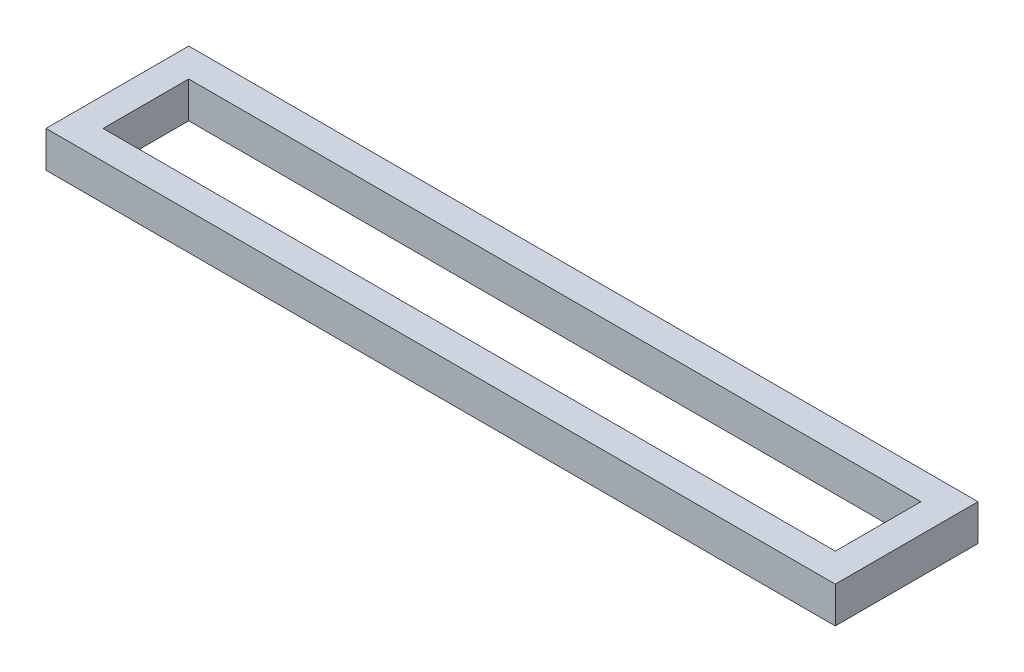
ISO-10303-21;
HEADER;
FILE_DESCRIPTION(('STEP AP214'),'2;1');
FILE_NAME('part.step','',(''),(''),'','','');
FILE_SCHEMA(('AUTOMOTIVE_DESIGN { 1 0 10303 214 1 1 1 1 }'));
ENDSEC;
DATA;
#1=APPLICATION_CONTEXT('core data for automotive mechanical design processes');
#2=APPLICATION_PROTOCOL_DEFINITION('international standard','automotive_design',2000,#1);
#3=PRODUCT_CONTEXT('',#1,'mechanical');
#4=PRODUCT('Part','Part','',(#3));
#5=PRODUCT_RELATED_PRODUCT_CATEGORY('part','',(#4));
#6=PRODUCT_DEFINITION_FORMATION('','',#4);
#7=PRODUCT_DEFINITION_CONTEXT('part definition',#1,'design');
#8=PRODUCT_DEFINITION('design','',#6,#7);
#9=PRODUCT_DEFINITION_SHAPE('','',#8);
#10=(LENGTH_UNIT() NAMED_UNIT(*) SI_UNIT(.MILLI.,.METRE.));
#11=(NAMED_UNIT(*) PLANE_ANGLE_UNIT() SI_UNIT($,.RADIAN.));
#12=(NAMED_UNIT(*) SI_UNIT($,.STERADIAN.) SOLID_ANGLE_UNIT());
#13=UNCERTAINTY_MEASURE_WITH_UNIT(LENGTH_MEASURE(1.E-05),#10,'distance_accuracy_value','');
#14=(GEOMETRIC_REPRESENTATION_CONTEXT(3) GLOBAL_UNCERTAINTY_ASSIGNED_CONTEXT((#13)) GLOBAL_UNIT_ASSIGNED_CONTEXT((#10,
#11,#12)) REPRESENTATION_CONTEXT('',''));
#15=CARTESIAN_POINT('',(0.,0.,0.));
#16=DIRECTION('',(0.,0.,1.));
#17=DIRECTION('',(1.,0.,0.));
#18=AXIS2_PLACEMENT_3D('',#15,#16,#17);
#19=CARTESIAN_POINT('',(0.,6.35,0.));
#20=DIRECTION('',(0.,-1.,0.));
#21=DIRECTION('',(0.,0.,-1.));
#22=AXIS2_PLACEMENT_3D('',#19,#20,#21);
#23=PLANE('',#22);
#24=DIRECTION('',(0.,0.,1.));
#25=VECTOR('',#24,1.);
#26=CARTESIAN_POINT('',(-5.,6.35,5.));
#27=LINE('',#26,#25);
#28=CARTESIAN_POINT('',(-5.,6.35,-20.));
#29=VERTEX_POINT('',#28);
#30=CARTESIAN_POINT('',(-5.,6.35,5.));
#31=VERTEX_POINT('',#30);
#32=EDGE_CURVE('E159',#29,#31,#27,.T.);
#33=ORIENTED_EDGE('',*,*,#32,.T.);
#34=DIRECTION('',(1.,0.,0.));
#35=VECTOR('',#34,1.);
#36=CARTESIAN_POINT('',(-5.,6.35,5.));
#37=LINE('',#36,#35);
#38=CARTESIAN_POINT('',(133.25,6.35,5.));
#39=VERTEX_POINT('',#38);
#40=EDGE_CURVE('E163',#31,#39,#37,.T.);
#41=ORIENTED_EDGE('',*,*,#40,.T.);
#42=DIRECTION('',(0.,0.,-1.));
#43=VECTOR('',#42,1.);
#44=CARTESIAN_POINT('',(133.25,6.35,5.));
#45=LINE('',#44,#43);
#46=CARTESIAN_POINT('',(133.25,6.35,-20.));
#47=VERTEX_POINT('',#46);
#48=EDGE_CURVE('E167',#39,#47,#45,.T.);
#49=ORIENTED_EDGE('',*,*,#48,.T.);
#50=DIRECTION('',(-1.,0.,0.));
#51=VECTOR('',#50,1.);
#52=CARTESIAN_POINT('',(-5.,6.35,-20.));
#53=LINE('',#52,#51);
#54=EDGE_CURVE('E170',#47,#29,#53,.T.);
#55=ORIENTED_EDGE('',*,*,#54,.T.);
#56=EDGE_LOOP('',(#33,#41,#49,#55));
#57=FACE_BOUND('',#56,.T.);
#58=DIRECTION('',(0.,0.,1.));
#59=VECTOR('',#58,1.);
#60=CARTESIAN_POINT('',(0.,6.35,0.));
#61=LINE('',#60,#59);
#62=CARTESIAN_POINT('',(0.,6.35,-15.));
#63=VERTEX_POINT('',#62);
#64=CARTESIAN_POINT('',(0.,6.35,0.));
#65=VERTEX_POINT('',#64);
#66=EDGE_CURVE('E111',#63,#65,#61,.T.);
#67=ORIENTED_EDGE('',*,*,#66,.F.);
#68=DIRECTION('',(-1.,0.,0.));
#69=VECTOR('',#68,1.);
#70=CARTESIAN_POINT('',(0.,6.35,-15.));
#71=LINE('',#70,#69);
#72=CARTESIAN_POINT('',(128.25,6.35,-15.));
#73=VERTEX_POINT('',#72);
#74=EDGE_CURVE('E137',#73,#63,#71,.T.);
#75=ORIENTED_EDGE('',*,*,#74,.F.);
#76=DIRECTION('',(0.,0.,-1.));
#77=VECTOR('',#76,1.);
#78=CARTESIAN_POINT('',(128.25,6.35,0.));
#79=LINE('',#78,#77);
#80=CARTESIAN_POINT('',(128.25,6.35,0.));
#81=VERTEX_POINT('',#80);
#82=EDGE_CURVE('E133',#81,#73,#79,.T.);
#83=ORIENTED_EDGE('',*,*,#82,.F.);
#84=DIRECTION('',(1.,0.,0.));
#85=VECTOR('',#84,1.);
#86=CARTESIAN_POINT('',(0.,6.35,0.));
#87=LINE('',#86,#85);
#88=EDGE_CURVE('E120',#65,#81,#87,.T.);
#89=ORIENTED_EDGE('',*,*,#88,.F.);
#90=EDGE_LOOP('',(#67,#75,#83,#89));
#91=FACE_BOUND('',#90,.T.);
#92=ADVANCED_FACE('F45',(#57,#91),#23,.F.);
#93=CARTESIAN_POINT('',(0.,0.,0.));
#94=DIRECTION('',(0.,-1.,0.));
#95=DIRECTION('',(0.,0.,-1.));
#96=AXIS2_PLACEMENT_3D('',#93,#94,#95);
#97=PLANE('',#96);
#98=DIRECTION('',(0.,0.,1.));
#99=VECTOR('',#98,1.);
#100=CARTESIAN_POINT('',(-5.,0.,5.));
#101=LINE('',#100,#99);
#102=CARTESIAN_POINT('',(-5.,0.,-20.));
#103=VERTEX_POINT('',#102);
#104=CARTESIAN_POINT('',(-5.,0.,5.));
#105=VERTEX_POINT('',#104);
#106=EDGE_CURVE('E129',#103,#105,#101,.T.);
#107=ORIENTED_EDGE('',*,*,#106,.F.);
#108=DIRECTION('',(-1.,0.,0.));
#109=VECTOR('',#108,1.);
#110=CARTESIAN_POINT('',(-5.,0.,-20.));
#111=LINE('',#110,#109);
#112=CARTESIAN_POINT('',(133.25,0.,-20.));
#113=VERTEX_POINT('',#112);
#114=EDGE_CURVE('E164',#113,#103,#111,.T.);
#115=ORIENTED_EDGE('',*,*,#114,.F.);
#116=DIRECTION('',(0.,0.,-1.));
#117=VECTOR('',#116,1.);
#118=CARTESIAN_POINT('',(133.25,0.,5.));
#119=LINE('',#118,#117);
#120=CARTESIAN_POINT('',(133.25,0.,5.));
#121=VERTEX_POINT('',#120);
#122=EDGE_CURVE('E180',#121,#113,#119,.T.);
#123=ORIENTED_EDGE('',*,*,#122,.F.);
#124=DIRECTION('',(1.,0.,0.));
#125=VECTOR('',#124,1.);
#126=CARTESIAN_POINT('',(-5.,0.,5.));
#127=LINE('',#126,#125);
#128=EDGE_CURVE('E177',#105,#121,#127,.T.);
#129=ORIENTED_EDGE('',*,*,#128,.F.);
#130=EDGE_LOOP('',(#107,#115,#123,#129));
#131=FACE_BOUND('',#130,.T.);
#132=DIRECTION('',(-1.,0.,0.));
#133=VECTOR('',#132,1.);
#134=CARTESIAN_POINT('',(0.,0.,-15.));
#135=LINE('',#134,#133);
#136=CARTESIAN_POINT('',(128.25,0.,-15.));
#137=VERTEX_POINT('',#136);
#138=CARTESIAN_POINT('',(0.,0.,-15.));
#139=VERTEX_POINT('',#138);
#140=EDGE_CURVE('E121',#137,#139,#135,.T.);
#141=ORIENTED_EDGE('',*,*,#140,.T.);
#142=DIRECTION('',(0.,0.,1.));
#143=VECTOR('',#142,1.);
#144=CARTESIAN_POINT('',(0.,0.,0.));
#145=LINE('',#144,#143);
#146=CARTESIAN_POINT('',(0.,0.,0.));
#147=VERTEX_POINT('',#146);
#148=EDGE_CURVE('E69',#139,#147,#145,.T.);
#149=ORIENTED_EDGE('',*,*,#148,.T.);
#150=DIRECTION('',(1.,0.,0.));
#151=VECTOR('',#150,1.);
#152=CARTESIAN_POINT('',(0.,0.,0.));
#153=LINE('',#152,#151);
#154=CARTESIAN_POINT('',(128.25,0.,0.));
#155=VERTEX_POINT('',#154);
#156=EDGE_CURVE('E127',#147,#155,#153,.T.);
#157=ORIENTED_EDGE('',*,*,#156,.T.);
#158=DIRECTION('',(0.,0.,-1.));
#159=VECTOR('',#158,1.);
#160=CARTESIAN_POINT('',(128.25,0.,0.));
#161=LINE('',#160,#159);
#162=EDGE_CURVE('E146',#155,#137,#161,.T.);
#163=ORIENTED_EDGE('',*,*,#162,.T.);
#164=EDGE_LOOP('',(#141,#149,#157,#163));
#165=FACE_BOUND('',#164,.T.);
#166=ADVANCED_FACE('F203',(#131,#165),#97,.T.);
#167=CARTESIAN_POINT('',(-5.,6.35,5.));
#168=DIRECTION('',(1.,0.,0.));
#169=DIRECTION('',(0.,0.,-1.));
#170=AXIS2_PLACEMENT_3D('',#167,#168,#169);
#171=PLANE('',#170);
#172=ORIENTED_EDGE('',*,*,#106,.T.);
#173=DIRECTION('',(0.,-1.,0.));
#174=VECTOR('',#173,1.);
#175=CARTESIAN_POINT('',(-5.,6.35,5.));
#176=LINE('',#175,#174);
#177=EDGE_CURVE('E11',#31,#105,#176,.T.);
#178=ORIENTED_EDGE('',*,*,#177,.F.);
#179=ORIENTED_EDGE('',*,*,#32,.F.);
#180=DIRECTION('',(0.,-1.,0.));
#181=VECTOR('',#180,1.);
#182=CARTESIAN_POINT('',(-5.,6.35,-20.));
#183=LINE('',#182,#181);
#184=EDGE_CURVE('E173',#29,#103,#183,.T.);
#185=ORIENTED_EDGE('',*,*,#184,.T.);
#186=EDGE_LOOP('',(#172,#178,#179,#185));
#187=FACE_BOUND('',#186,.T.);
#188=ADVANCED_FACE('F47',(#187),#171,.F.);
#189=CARTESIAN_POINT('',(-5.,6.35,5.));
#190=DIRECTION('',(0.,0.,-1.));
#191=DIRECTION('',(-1.,0.,0.));
#192=AXIS2_PLACEMENT_3D('',#189,#190,#191);
#193=PLANE('',#192);
#194=ORIENTED_EDGE('',*,*,#128,.T.);
#195=DIRECTION('',(0.,-1.,0.));
#196=VECTOR('',#195,1.);
#197=CARTESIAN_POINT('',(133.25,6.35,5.));
#198=LINE('',#197,#196);
#199=EDGE_CURVE('E54',#39,#121,#198,.T.);
#200=ORIENTED_EDGE('',*,*,#199,.F.);
#201=ORIENTED_EDGE('',*,*,#40,.F.);
#202=ORIENTED_EDGE('',*,*,#177,.T.);
#203=EDGE_LOOP('',(#194,#200,#201,#202));
#204=FACE_BOUND('',#203,.T.);
#205=ADVANCED_FACE('F213',(#204),#193,.F.);
#206=CARTESIAN_POINT('',(133.25,6.35,5.));
#207=DIRECTION('',(-1.,0.,0.));
#208=DIRECTION('',(0.,0.,1.));
#209=AXIS2_PLACEMENT_3D('',#206,#207,#208);
#210=PLANE('',#209);
#211=ORIENTED_EDGE('',*,*,#122,.T.);
#212=DIRECTION('',(0.,-1.,0.));
#213=VECTOR('',#212,1.);
#214=CARTESIAN_POINT('',(133.25,6.35,-20.));
#215=LINE('',#214,#213);
#216=EDGE_CURVE('E188',#47,#113,#215,.T.);
#217=ORIENTED_EDGE('',*,*,#216,.F.);
#218=ORIENTED_EDGE('',*,*,#48,.F.);
#219=ORIENTED_EDGE('',*,*,#199,.T.);
#220=EDGE_LOOP('',(#211,#217,#218,#219));
#221=FACE_BOUND('',#220,.T.);
#222=ADVANCED_FACE('F197',(#221),#210,.F.);
#223=CARTESIAN_POINT('',(-5.,6.35,-20.));
#224=DIRECTION('',(0.,0.,1.));
#225=DIRECTION('',(1.,0.,0.));
#226=AXIS2_PLACEMENT_3D('',#223,#224,#225);
#227=PLANE('',#226);
#228=ORIENTED_EDGE('',*,*,#114,.T.);
#229=ORIENTED_EDGE('',*,*,#184,.F.);
#230=ORIENTED_EDGE('',*,*,#54,.F.);
#231=ORIENTED_EDGE('',*,*,#216,.T.);
#232=EDGE_LOOP('',(#228,#229,#230,#231));
#233=FACE_BOUND('',#232,.T.);
#234=ADVANCED_FACE('F207',(#233),#227,.F.);
#235=CARTESIAN_POINT('',(0.,6.35,0.));
#236=DIRECTION('',(1.,0.,0.));
#237=DIRECTION('',(0.,0.,-1.));
#238=AXIS2_PLACEMENT_3D('',#235,#236,#237);
#239=PLANE('',#238);
#240=ORIENTED_EDGE('',*,*,#148,.F.);
#241=DIRECTION('',(0.,-1.,0.));
#242=VECTOR('',#241,1.);
#243=CARTESIAN_POINT('',(0.,6.35,-15.));
#244=LINE('',#243,#242);
#245=EDGE_CURVE('E115',#63,#139,#244,.T.);
#246=ORIENTED_EDGE('',*,*,#245,.F.);
#247=ORIENTED_EDGE('',*,*,#66,.T.);
#248=DIRECTION('',(0.,-1.,0.));
#249=VECTOR('',#248,1.);
#250=CARTESIAN_POINT('',(0.,6.35,0.));
#251=LINE('',#250,#249);
#252=EDGE_CURVE('E114',#65,#147,#251,.T.);
#253=ORIENTED_EDGE('',*,*,#252,.T.);
#254=EDGE_LOOP('',(#240,#246,#247,#253));
#255=FACE_BOUND('',#254,.T.);
#256=ADVANCED_FACE('F113',(#255),#239,.T.);
#257=CARTESIAN_POINT('',(0.,6.35,0.));
#258=DIRECTION('',(0.,0.,-1.));
#259=DIRECTION('',(-1.,0.,0.));
#260=AXIS2_PLACEMENT_3D('',#257,#258,#259);
#261=PLANE('',#260);
#262=ORIENTED_EDGE('',*,*,#156,.F.);
#263=ORIENTED_EDGE('',*,*,#252,.F.);
#264=ORIENTED_EDGE('',*,*,#88,.T.);
#265=DIRECTION('',(0.,-1.,0.));
#266=VECTOR('',#265,1.);
#267=CARTESIAN_POINT('',(128.25,6.35,0.));
#268=LINE('',#267,#266);
#269=EDGE_CURVE('E130',#81,#155,#268,.T.);
#270=ORIENTED_EDGE('',*,*,#269,.T.);
#271=EDGE_LOOP('',(#262,#263,#264,#270));
#272=FACE_BOUND('',#271,.T.);
#273=ADVANCED_FACE('F124',(#272),#261,.T.);
#274=CARTESIAN_POINT('',(128.25,6.35,0.));
#275=DIRECTION('',(-1.,0.,0.));
#276=DIRECTION('',(0.,0.,1.));
#277=AXIS2_PLACEMENT_3D('',#274,#275,#276);
#278=PLANE('',#277);
#279=ORIENTED_EDGE('',*,*,#162,.F.);
#280=ORIENTED_EDGE('',*,*,#269,.F.);
#281=ORIENTED_EDGE('',*,*,#82,.T.);
#282=DIRECTION('',(0.,-1.,0.));
#283=VECTOR('',#282,1.);
#284=CARTESIAN_POINT('',(128.25,6.35,-15.));
#285=LINE('',#284,#283);
#286=EDGE_CURVE('E61',#73,#137,#285,.T.);
#287=ORIENTED_EDGE('',*,*,#286,.T.);
#288=EDGE_LOOP('',(#279,#280,#281,#287));
#289=FACE_BOUND('',#288,.T.);
#290=ADVANCED_FACE('F236',(#289),#278,.T.);
#291=CARTESIAN_POINT('',(0.,6.35,-15.));
#292=DIRECTION('',(0.,0.,1.));
#293=DIRECTION('',(1.,0.,0.));
#294=AXIS2_PLACEMENT_3D('',#291,#292,#293);
#295=PLANE('',#294);
#296=ORIENTED_EDGE('',*,*,#140,.F.);
#297=ORIENTED_EDGE('',*,*,#286,.F.);
#298=ORIENTED_EDGE('',*,*,#74,.T.);
#299=ORIENTED_EDGE('',*,*,#245,.T.);
#300=EDGE_LOOP('',(#296,#297,#298,#299));
#301=FACE_BOUND('',#300,.T.);
#302=ADVANCED_FACE('F240',(#301),#295,.T.);
#303=CLOSED_SHELL('',(#92,#166,#188,#205,#222,#234,#256,#273,#290,#302));
#304=MANIFOLD_SOLID_BREP('B2',#303);
#305=ADVANCED_BREP_SHAPE_REPRESENTATION('',(#18,#304),#14);
#306=SHAPE_DEFINITION_REPRESENTATION(#9,#305);
ENDSEC;
END-ISO-10303-21;
